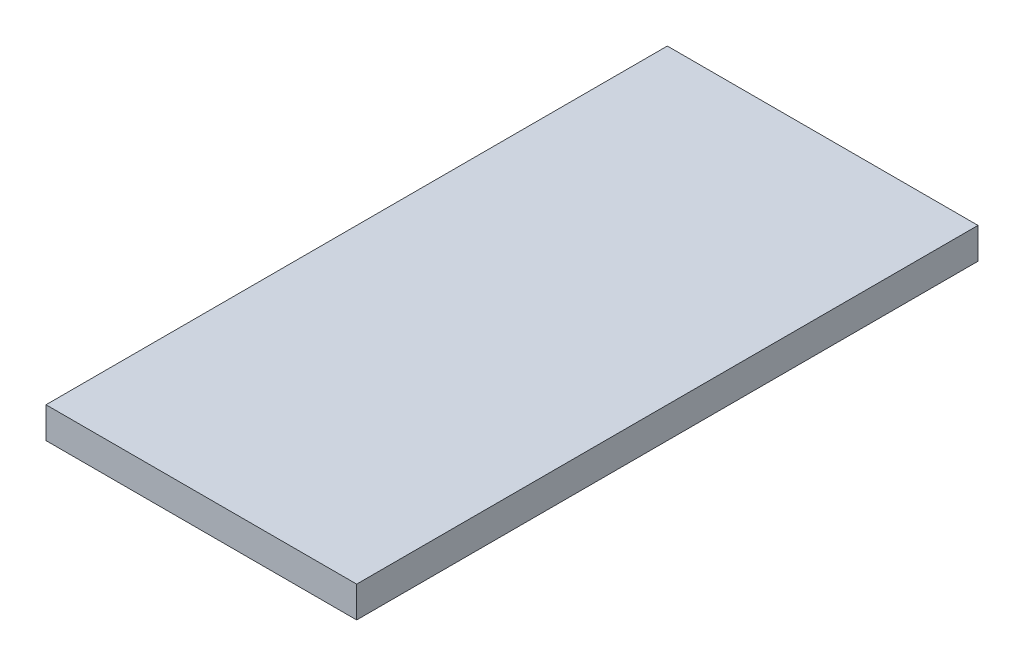
ISO-10303-21;
HEADER;
FILE_DESCRIPTION(('STEP AP214'),'2;1');
FILE_NAME('part.step','',(''),(''),'','','');
FILE_SCHEMA(('AUTOMOTIVE_DESIGN { 1 0 10303 214 1 1 1 1 }'));
ENDSEC;
DATA;
#1=APPLICATION_CONTEXT('core data for automotive mechanical design processes');
#2=APPLICATION_PROTOCOL_DEFINITION('international standard','automotive_design',2000,#1);
#3=PRODUCT_CONTEXT('',#1,'mechanical');
#4=PRODUCT('Part','Part','',(#3));
#5=PRODUCT_RELATED_PRODUCT_CATEGORY('part','',(#4));
#6=PRODUCT_DEFINITION_FORMATION('','',#4);
#7=PRODUCT_DEFINITION_CONTEXT('part definition',#1,'design');
#8=PRODUCT_DEFINITION('design','',#6,#7);
#9=PRODUCT_DEFINITION_SHAPE('','',#8);
#10=(LENGTH_UNIT() NAMED_UNIT(*) SI_UNIT(.MILLI.,.METRE.));
#11=(NAMED_UNIT(*) PLANE_ANGLE_UNIT() SI_UNIT($,.RADIAN.));
#12=(NAMED_UNIT(*) SI_UNIT($,.STERADIAN.) SOLID_ANGLE_UNIT());
#13=UNCERTAINTY_MEASURE_WITH_UNIT(LENGTH_MEASURE(1.E-05),#10,'distance_accuracy_value','');
#14=(GEOMETRIC_REPRESENTATION_CONTEXT(3) GLOBAL_UNCERTAINTY_ASSIGNED_CONTEXT((#13)) GLOBAL_UNIT_ASSIGNED_CONTEXT((#10,
#11,#12)) REPRESENTATION_CONTEXT('',''));
#15=CARTESIAN_POINT('',(0.,0.,0.));
#16=DIRECTION('',(0.,0.,1.));
#17=DIRECTION('',(1.,0.,0.));
#18=AXIS2_PLACEMENT_3D('',#15,#16,#17);
#19=CARTESIAN_POINT('',(0.,0.5,0.));
#20=DIRECTION('',(1.,0.,0.));
#21=DIRECTION('',(0.,0.,-1.));
#22=AXIS2_PLACEMENT_3D('',#19,#20,#21);
#23=PLANE('',#22);
#24=DIRECTION('',(0.,0.,1.));
#25=VECTOR('',#24,1.);
#26=CARTESIAN_POINT('',(0.,0.,0.));
#27=LINE('',#26,#25);
#28=CARTESIAN_POINT('',(0.,0.,-10.));
#29=VERTEX_POINT('',#28);
#30=CARTESIAN_POINT('',(0.,0.,0.));
#31=VERTEX_POINT('',#30);
#32=EDGE_CURVE('E104',#29,#31,#27,.T.);
#33=ORIENTED_EDGE('',*,*,#32,.T.);
#34=DIRECTION('',(0.,-1.,0.));
#35=VECTOR('',#34,1.);
#36=CARTESIAN_POINT('',(0.,0.5,0.));
#37=LINE('',#36,#35);
#38=CARTESIAN_POINT('',(0.,0.5,0.));
#39=VERTEX_POINT('',#38);
#40=EDGE_CURVE('E11',#39,#31,#37,.T.);
#41=ORIENTED_EDGE('',*,*,#40,.F.);
#42=DIRECTION('',(0.,0.,1.));
#43=VECTOR('',#42,1.);
#44=CARTESIAN_POINT('',(0.,0.5,0.));
#45=LINE('',#44,#43);
#46=CARTESIAN_POINT('',(0.,0.5,-10.));
#47=VERTEX_POINT('',#46);
#48=EDGE_CURVE('E92',#47,#39,#45,.T.);
#49=ORIENTED_EDGE('',*,*,#48,.F.);
#50=DIRECTION('',(0.,-1.,0.));
#51=VECTOR('',#50,1.);
#52=CARTESIAN_POINT('',(0.,0.5,-10.));
#53=LINE('',#52,#51);
#54=EDGE_CURVE('E100',#47,#29,#53,.T.);
#55=ORIENTED_EDGE('',*,*,#54,.T.);
#56=EDGE_LOOP('',(#33,#41,#49,#55));
#57=FACE_BOUND('',#56,.T.);
#58=ADVANCED_FACE('F41',(#57),#23,.F.);
#59=CARTESIAN_POINT('',(0.,0.5,0.));
#60=DIRECTION('',(0.,0.,-1.));
#61=DIRECTION('',(-1.,0.,0.));
#62=AXIS2_PLACEMENT_3D('',#59,#60,#61);
#63=PLANE('',#62);
#64=DIRECTION('',(1.,0.,0.));
#65=VECTOR('',#64,1.);
#66=CARTESIAN_POINT('',(0.,0.,0.));
#67=LINE('',#66,#65);
#68=CARTESIAN_POINT('',(5.,0.,0.));
#69=VERTEX_POINT('',#68);
#70=EDGE_CURVE('E96',#31,#69,#67,.T.);
#71=ORIENTED_EDGE('',*,*,#70,.T.);
#72=DIRECTION('',(0.,-1.,0.));
#73=VECTOR('',#72,1.);
#74=CARTESIAN_POINT('',(5.,0.5,0.));
#75=LINE('',#74,#73);
#76=CARTESIAN_POINT('',(5.,0.5,0.));
#77=VERTEX_POINT('',#76);
#78=EDGE_CURVE('E49',#77,#69,#75,.T.);
#79=ORIENTED_EDGE('',*,*,#78,.F.);
#80=DIRECTION('',(1.,0.,0.));
#81=VECTOR('',#80,1.);
#82=CARTESIAN_POINT('',(0.,0.5,0.));
#83=LINE('',#82,#81);
#84=EDGE_CURVE('E87',#39,#77,#83,.T.);
#85=ORIENTED_EDGE('',*,*,#84,.F.);
#86=ORIENTED_EDGE('',*,*,#40,.T.);
#87=EDGE_LOOP('',(#71,#79,#85,#86));
#88=FACE_BOUND('',#87,.T.);
#89=ADVANCED_FACE('F95',(#88),#63,.F.);
#90=CARTESIAN_POINT('',(5.,0.5,0.));
#91=DIRECTION('',(-1.,0.,0.));
#92=DIRECTION('',(0.,0.,1.));
#93=AXIS2_PLACEMENT_3D('',#90,#91,#92);
#94=PLANE('',#93);
#95=DIRECTION('',(0.,0.,-1.));
#96=VECTOR('',#95,1.);
#97=CARTESIAN_POINT('',(5.,0.,0.));
#98=LINE('',#97,#96);
#99=CARTESIAN_POINT('',(5.,0.,-10.));
#100=VERTEX_POINT('',#99);
#101=EDGE_CURVE('E74',#69,#100,#98,.T.);
#102=ORIENTED_EDGE('',*,*,#101,.T.);
#103=DIRECTION('',(0.,-1.,0.));
#104=VECTOR('',#103,1.);
#105=CARTESIAN_POINT('',(5.,0.5,-10.));
#106=LINE('',#105,#104);
#107=CARTESIAN_POINT('',(5.,0.5,-10.));
#108=VERTEX_POINT('',#107);
#109=EDGE_CURVE('E97',#108,#100,#106,.T.);
#110=ORIENTED_EDGE('',*,*,#109,.F.);
#111=DIRECTION('',(0.,0.,-1.));
#112=VECTOR('',#111,1.);
#113=CARTESIAN_POINT('',(5.,0.5,0.));
#114=LINE('',#113,#112);
#115=EDGE_CURVE('E90',#77,#108,#114,.T.);
#116=ORIENTED_EDGE('',*,*,#115,.F.);
#117=ORIENTED_EDGE('',*,*,#78,.T.);
#118=EDGE_LOOP('',(#102,#110,#116,#117));
#119=FACE_BOUND('',#118,.T.);
#120=ADVANCED_FACE('F98',(#119),#94,.F.);
#121=CARTESIAN_POINT('',(0.,0.5,-10.));
#122=DIRECTION('',(0.,0.,1.));
#123=DIRECTION('',(1.,0.,0.));
#124=AXIS2_PLACEMENT_3D('',#121,#122,#123);
#125=PLANE('',#124);
#126=DIRECTION('',(-1.,0.,0.));
#127=VECTOR('',#126,1.);
#128=CARTESIAN_POINT('',(0.,0.,-10.));
#129=LINE('',#128,#127);
#130=EDGE_CURVE('E80',#100,#29,#129,.T.);
#131=ORIENTED_EDGE('',*,*,#130,.T.);
#132=ORIENTED_EDGE('',*,*,#54,.F.);
#133=DIRECTION('',(-1.,0.,0.));
#134=VECTOR('',#133,1.);
#135=CARTESIAN_POINT('',(0.,0.5,-10.));
#136=LINE('',#135,#134);
#137=EDGE_CURVE('E57',#108,#47,#136,.T.);
#138=ORIENTED_EDGE('',*,*,#137,.F.);
#139=ORIENTED_EDGE('',*,*,#109,.T.);
#140=EDGE_LOOP('',(#131,#132,#138,#139));
#141=FACE_BOUND('',#140,.T.);
#142=ADVANCED_FACE('F111',(#141),#125,.F.);
#143=CARTESIAN_POINT('',(0.,0.5,0.));
#144=DIRECTION('',(0.,-1.,0.));
#145=DIRECTION('',(0.,0.,-1.));
#146=AXIS2_PLACEMENT_3D('',#143,#144,#145);
#147=PLANE('',#146);
#148=ORIENTED_EDGE('',*,*,#48,.T.);
#149=ORIENTED_EDGE('',*,*,#84,.T.);
#150=ORIENTED_EDGE('',*,*,#115,.T.);
#151=ORIENTED_EDGE('',*,*,#137,.T.);
#152=EDGE_LOOP('',(#148,#149,#150,#151));
#153=FACE_BOUND('',#152,.T.);
#154=ADVANCED_FACE('F88',(#153),#147,.F.);
#155=CARTESIAN_POINT('',(0.,0.,0.));
#156=DIRECTION('',(0.,-1.,0.));
#157=DIRECTION('',(0.,0.,-1.));
#158=AXIS2_PLACEMENT_3D('',#155,#156,#157);
#159=PLANE('',#158);
#160=ORIENTED_EDGE('',*,*,#32,.F.);
#161=ORIENTED_EDGE('',*,*,#130,.F.);
#162=ORIENTED_EDGE('',*,*,#101,.F.);
#163=ORIENTED_EDGE('',*,*,#70,.F.);
#164=EDGE_LOOP('',(#160,#161,#162,#163));
#165=FACE_BOUND('',#164,.T.);
#166=ADVANCED_FACE('F114',(#165),#159,.T.);
#167=CLOSED_SHELL('',(#58,#89,#120,#142,#154,#166));
#168=MANIFOLD_SOLID_BREP('B2',#167);
#169=ADVANCED_BREP_SHAPE_REPRESENTATION('',(#18,#168),#14);
#170=SHAPE_DEFINITION_REPRESENTATION(#9,#169);
ENDSEC;
END-ISO-10303-21;
